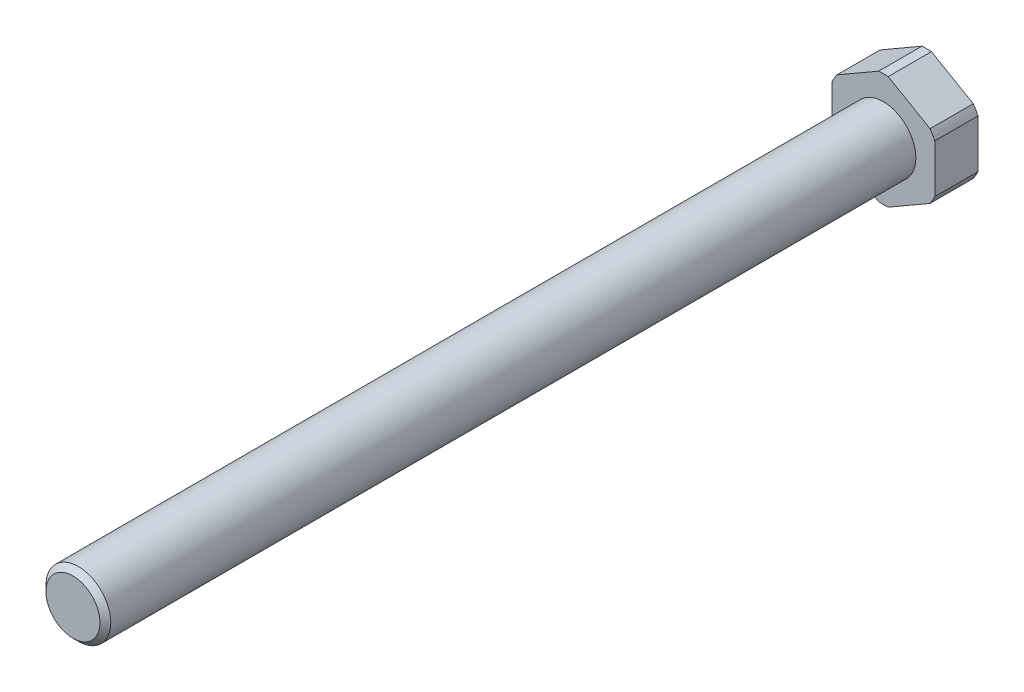
ISO-10303-21;
HEADER;
FILE_DESCRIPTION(('STEP AP214'),'2;1');
FILE_NAME('part.step','',(''),(''),'','','');
FILE_SCHEMA(('AUTOMOTIVE_DESIGN { 1 0 10303 214 1 1 1 1 }'));
ENDSEC;
DATA;
#1=APPLICATION_CONTEXT('core data for automotive mechanical design processes');
#2=APPLICATION_PROTOCOL_DEFINITION('international standard','automotive_design',2000,#1);
#3=PRODUCT_CONTEXT('',#1,'mechanical');
#4=PRODUCT('Part','Part','',(#3));
#5=PRODUCT_RELATED_PRODUCT_CATEGORY('part','',(#4));
#6=PRODUCT_DEFINITION_FORMATION('','',#4);
#7=PRODUCT_DEFINITION_CONTEXT('part definition',#1,'design');
#8=PRODUCT_DEFINITION('design','',#6,#7);
#9=PRODUCT_DEFINITION_SHAPE('','',#8);
#10=(LENGTH_UNIT() NAMED_UNIT(*) SI_UNIT(.MILLI.,.METRE.));
#11=(NAMED_UNIT(*) PLANE_ANGLE_UNIT() SI_UNIT($,.RADIAN.));
#12=(NAMED_UNIT(*) SI_UNIT($,.STERADIAN.) SOLID_ANGLE_UNIT());
#13=UNCERTAINTY_MEASURE_WITH_UNIT(LENGTH_MEASURE(1.E-05),#10,'distance_accuracy_value','');
#14=(GEOMETRIC_REPRESENTATION_CONTEXT(3) GLOBAL_UNCERTAINTY_ASSIGNED_CONTEXT((#13)) GLOBAL_UNIT_ASSIGNED_CONTEXT((#10,
#11,#12)) REPRESENTATION_CONTEXT('',''));
#15=CARTESIAN_POINT('',(0.,0.,0.));
#16=DIRECTION('',(0.,0.,1.));
#17=DIRECTION('',(1.,0.,0.));
#18=AXIS2_PLACEMENT_3D('',#15,#16,#17);
#19=CARTESIAN_POINT('',(0.,0.,8.));
#20=DIRECTION('',(0.,0.,-1.));
#21=DIRECTION('',(-1.,0.,0.));
#22=AXIS2_PLACEMENT_3D('',#19,#20,#21);
#23=CYLINDRICAL_SURFACE('',#22,10.5);
#24=CARTESIAN_POINT('',(0.,0.,8.));
#25=DIRECTION('',(0.,0.,1.));
#26=DIRECTION('',(1.,0.,0.));
#27=AXIS2_PLACEMENT_3D('',#24,#25,#26);
#28=CIRCLE('',#27,10.5);
#29=CARTESIAN_POINT('',(0.877016653792627,10.463309313452,8.));
#30=VERTEX_POINT('',#29);
#31=CARTESIAN_POINT('',(-0.877016653792554,10.463309313452,8.));
#32=VERTEX_POINT('',#31);
#33=EDGE_CURVE('E148',#30,#32,#28,.T.);
#34=ORIENTED_EDGE('',*,*,#33,.F.);
#35=DIRECTION('',(0.,0.,1.));
#36=VECTOR('',#35,1.);
#37=CARTESIAN_POINT('',(0.877016653792627,10.463309313452,0.));
#38=LINE('',#37,#36);
#39=CARTESIAN_POINT('',(0.877016653792627,10.463309313452,0.));
#40=VERTEX_POINT('',#39);
#41=EDGE_CURVE('E134',#40,#30,#38,.T.);
#42=ORIENTED_EDGE('',*,*,#41,.F.);
#43=CARTESIAN_POINT('',(0.,0.,0.));
#44=DIRECTION('',(0.,0.,1.));
#45=DIRECTION('',(1.,0.,0.));
#46=AXIS2_PLACEMENT_3D('',#43,#44,#45);
#47=CIRCLE('',#46,10.5);
#48=CARTESIAN_POINT('',(-0.877016653792554,10.463309313452,0.));
#49=VERTEX_POINT('',#48);
#50=EDGE_CURVE('E146',#40,#49,#47,.T.);
#51=ORIENTED_EDGE('',*,*,#50,.T.);
#52=DIRECTION('',(0.,0.,1.));
#53=VECTOR('',#52,1.);
#54=CARTESIAN_POINT('',(-0.877016653792554,10.463309313452,0.));
#55=LINE('',#54,#53);
#56=EDGE_CURVE('E243',#49,#32,#55,.T.);
#57=ORIENTED_EDGE('',*,*,#56,.T.);
#58=EDGE_LOOP('',(#34,#42,#51,#57));
#59=FACE_BOUND('',#58,.T.);
#60=ADVANCED_FACE('F44',(#59),#23,.T.);
#61=CARTESIAN_POINT('',(9.50000000000003,4.47213595499952,0.));
#62=VERTEX_POINT('',#61);
#63=CARTESIAN_POINT('',(8.62298334620744,5.99117335845234,0.));
#64=VERTEX_POINT('',#63);
#65=EDGE_CURVE('E156',#62,#64,#47,.T.);
#66=ORIENTED_EDGE('',*,*,#65,.T.);
#67=DIRECTION('',(0.,0.,1.));
#68=VECTOR('',#67,1.);
#69=CARTESIAN_POINT('',(8.62298334620745,5.99117335845233,0.));
#70=LINE('',#69,#68);
#71=CARTESIAN_POINT('',(8.62298334620745,5.99117335845233,8.));
#72=VERTEX_POINT('',#71);
#73=EDGE_CURVE('E60',#64,#72,#70,.T.);
#74=ORIENTED_EDGE('',*,*,#73,.T.);
#75=CARTESIAN_POINT('',(9.50000000000003,4.47213595499952,8.));
#76=VERTEX_POINT('',#75);
#77=EDGE_CURVE('E274',#76,#72,#28,.T.);
#78=ORIENTED_EDGE('',*,*,#77,.F.);
#79=DIRECTION('',(0.,0.,1.));
#80=VECTOR('',#79,1.);
#81=CARTESIAN_POINT('',(9.50000000000003,4.47213595499952,0.));
#82=LINE('',#81,#80);
#83=EDGE_CURVE('E200',#62,#76,#82,.T.);
#84=ORIENTED_EDGE('',*,*,#83,.F.);
#85=EDGE_LOOP('',(#66,#74,#78,#84));
#86=FACE_BOUND('',#85,.T.);
#87=ADVANCED_FACE('F312',(#86),#23,.T.);
#88=CARTESIAN_POINT('',(8.62298334620736,-5.99117335845245,0.));
#89=VERTEX_POINT('',#88);
#90=CARTESIAN_POINT('',(9.49999999999997,-4.47213595499965,0.));
#91=VERTEX_POINT('',#90);
#92=EDGE_CURVE('E163',#89,#91,#47,.T.);
#93=ORIENTED_EDGE('',*,*,#92,.T.);
#94=DIRECTION('',(0.,0.,1.));
#95=VECTOR('',#94,1.);
#96=CARTESIAN_POINT('',(9.49999999999997,-4.47213595499965,0.));
#97=LINE('',#96,#95);
#98=CARTESIAN_POINT('',(9.49999999999997,-4.47213595499965,8.));
#99=VERTEX_POINT('',#98);
#100=EDGE_CURVE('E68',#91,#99,#97,.T.);
#101=ORIENTED_EDGE('',*,*,#100,.T.);
#102=CARTESIAN_POINT('',(8.62298334620736,-5.99117335845245,8.));
#103=VERTEX_POINT('',#102);
#104=EDGE_CURVE('E272',#103,#99,#28,.T.);
#105=ORIENTED_EDGE('',*,*,#104,.F.);
#106=DIRECTION('',(0.,0.,1.));
#107=VECTOR('',#106,1.);
#108=CARTESIAN_POINT('',(8.62298334620736,-5.99117335845245,0.));
#109=LINE('',#108,#107);
#110=EDGE_CURVE('E194',#89,#103,#109,.T.);
#111=ORIENTED_EDGE('',*,*,#110,.F.);
#112=EDGE_LOOP('',(#93,#101,#105,#111));
#113=FACE_BOUND('',#112,.T.);
#114=ADVANCED_FACE('F191',(#113),#23,.T.);
#115=CARTESIAN_POINT('',(-0.877016653792701,-10.4633093134519,0.));
#116=VERTEX_POINT('',#115);
#117=CARTESIAN_POINT('',(0.877016653792476,-10.463309313452,0.));
#118=VERTEX_POINT('',#117);
#119=EDGE_CURVE('E165',#116,#118,#47,.T.);
#120=ORIENTED_EDGE('',*,*,#119,.T.);
#121=DIRECTION('',(0.,0.,1.));
#122=VECTOR('',#121,1.);
#123=CARTESIAN_POINT('',(0.877016653792481,-10.463309313452,0.));
#124=LINE('',#123,#122);
#125=CARTESIAN_POINT('',(0.877016653792481,-10.463309313452,8.));
#126=VERTEX_POINT('',#125);
#127=EDGE_CURVE('E207',#118,#126,#124,.T.);
#128=ORIENTED_EDGE('',*,*,#127,.T.);
#129=CARTESIAN_POINT('',(-0.877016653792701,-10.4633093134519,8.));
#130=VERTEX_POINT('',#129);
#131=EDGE_CURVE('E178',#130,#126,#28,.T.);
#132=ORIENTED_EDGE('',*,*,#131,.F.);
#133=DIRECTION('',(0.,0.,1.));
#134=VECTOR('',#133,1.);
#135=CARTESIAN_POINT('',(-0.877016653792701,-10.4633093134519,0.));
#136=LINE('',#135,#134);
#137=EDGE_CURVE('E227',#116,#130,#136,.T.);
#138=ORIENTED_EDGE('',*,*,#137,.F.);
#139=EDGE_LOOP('',(#120,#128,#132,#138));
#140=FACE_BOUND('',#139,.T.);
#141=ADVANCED_FACE('F289',(#140),#23,.T.);
#142=CARTESIAN_POINT('',(-8.62298334620741,5.99117335845239,8.));
#143=VERTEX_POINT('',#142);
#144=CARTESIAN_POINT('',(-9.5,4.47213595499958,8.));
#145=VERTEX_POINT('',#144);
#146=EDGE_CURVE('E169',#143,#145,#28,.T.);
#147=ORIENTED_EDGE('',*,*,#146,.F.);
#148=DIRECTION('',(0.,0.,1.));
#149=VECTOR('',#148,1.);
#150=CARTESIAN_POINT('',(-8.62298334620741,5.99117335845239,0.));
#151=LINE('',#150,#149);
#152=CARTESIAN_POINT('',(-8.62298334620741,5.99117335845239,0.));
#153=VERTEX_POINT('',#152);
#154=EDGE_CURVE('E238',#153,#143,#151,.T.);
#155=ORIENTED_EDGE('',*,*,#154,.F.);
#156=CARTESIAN_POINT('',(-9.5,4.47213595499958,0.));
#157=VERTEX_POINT('',#156);
#158=EDGE_CURVE('E157',#153,#157,#47,.T.);
#159=ORIENTED_EDGE('',*,*,#158,.T.);
#160=DIRECTION('',(0.,0.,1.));
#161=VECTOR('',#160,1.);
#162=CARTESIAN_POINT('',(-9.5,4.47213595499958,0.));
#163=LINE('',#162,#161);
#164=EDGE_CURVE('E164',#157,#145,#163,.T.);
#165=ORIENTED_EDGE('',*,*,#164,.T.);
#166=EDGE_LOOP('',(#147,#155,#159,#165));
#167=FACE_BOUND('',#166,.T.);
#168=ADVANCED_FACE('F299',(#167),#23,.T.);
#169=CARTESIAN_POINT('',(-9.5,-4.47213595499958,0.));
#170=VERTEX_POINT('',#169);
#171=CARTESIAN_POINT('',(-8.62298334620749,-5.99117335845227,0.));
#172=VERTEX_POINT('',#171);
#173=EDGE_CURVE('E159',#170,#172,#47,.T.);
#174=ORIENTED_EDGE('',*,*,#173,.T.);
#175=DIRECTION('',(0.,0.,1.));
#176=VECTOR('',#175,1.);
#177=CARTESIAN_POINT('',(-8.62298334620749,-5.99117335845227,0.));
#178=LINE('',#177,#176);
#179=CARTESIAN_POINT('',(-8.62298334620749,-5.99117335845227,8.));
#180=VERTEX_POINT('',#179);
#181=EDGE_CURVE('E218',#172,#180,#178,.T.);
#182=ORIENTED_EDGE('',*,*,#181,.T.);
#183=CARTESIAN_POINT('',(-9.5,-4.47213595499958,8.));
#184=VERTEX_POINT('',#183);
#185=EDGE_CURVE('E177',#184,#180,#28,.T.);
#186=ORIENTED_EDGE('',*,*,#185,.F.);
#187=DIRECTION('',(0.,0.,1.));
#188=VECTOR('',#187,1.);
#189=CARTESIAN_POINT('',(-9.5,-4.47213595499958,0.));
#190=LINE('',#189,#188);
#191=EDGE_CURVE('E253',#170,#184,#190,.T.);
#192=ORIENTED_EDGE('',*,*,#191,.F.);
#193=EDGE_LOOP('',(#174,#182,#186,#192));
#194=FACE_BOUND('',#193,.T.);
#195=ADVANCED_FACE('F292',(#194),#23,.T.);
#196=CARTESIAN_POINT('',(0.,0.,8.));
#197=DIRECTION('',(0.,0.,1.));
#198=DIRECTION('',(1.,0.,0.));
#199=AXIS2_PLACEMENT_3D('',#196,#197,#198);
#200=PLANE('',#199);
#201=CARTESIAN_POINT('',(0.,0.,8.));
#202=DIRECTION('',(0.,0.,1.));
#203=DIRECTION('',(1.,0.,0.));
#204=AXIS2_PLACEMENT_3D('',#201,#202,#203);
#205=CIRCLE('',#204,6.);
#206=CARTESIAN_POINT('',(6.,0.,8.));
#207=VERTEX_POINT('',#206);
#208=EDGE_CURVE('E231',#207,#207,#205,.T.);
#209=ORIENTED_EDGE('',*,*,#208,.F.);
#210=EDGE_LOOP('',(#209));
#211=FACE_BOUND('',#210,.T.);
#212=DIRECTION('',(0.866025403784436,-0.500000000000004,0.));
#213=VECTOR('',#212,1.);
#214=CARTESIAN_POINT('',(8.62298334620745,5.99117335845233,8.));
#215=LINE('',#214,#213);
#216=EDGE_CURVE('E141',#30,#72,#215,.T.);
#217=ORIENTED_EDGE('',*,*,#216,.F.);
#218=ORIENTED_EDGE('',*,*,#33,.T.);
#219=DIRECTION('',(0.86602540378444,0.499999999999998,0.));
#220=VECTOR('',#219,1.);
#221=CARTESIAN_POINT('',(-0.877016653792554,10.463309313452,8.));
#222=LINE('',#221,#220);
#223=EDGE_CURVE('E239',#143,#32,#222,.T.);
#224=ORIENTED_EDGE('',*,*,#223,.F.);
#225=ORIENTED_EDGE('',*,*,#146,.T.);
#226=DIRECTION('',(0.,1.,0.));
#227=VECTOR('',#226,1.);
#228=CARTESIAN_POINT('',(-9.5,4.47213595499958,8.));
#229=LINE('',#228,#227);
#230=EDGE_CURVE('E246',#184,#145,#229,.T.);
#231=ORIENTED_EDGE('',*,*,#230,.F.);
#232=ORIENTED_EDGE('',*,*,#185,.T.);
#233=DIRECTION('',(-0.866025403784433,0.50000000000001,0.));
#234=VECTOR('',#233,1.);
#235=CARTESIAN_POINT('',(-8.62298334620749,-5.99117335845227,8.));
#236=LINE('',#235,#234);
#237=EDGE_CURVE('E228',#130,#180,#236,.T.);
#238=ORIENTED_EDGE('',*,*,#237,.F.);
#239=ORIENTED_EDGE('',*,*,#131,.T.);
#240=DIRECTION('',(-0.866025403784443,-0.499999999999992,0.));
#241=VECTOR('',#240,1.);
#242=CARTESIAN_POINT('',(0.877016653792481,-10.463309313452,8.));
#243=LINE('',#242,#241);
#244=EDGE_CURVE('E215',#103,#126,#243,.T.);
#245=ORIENTED_EDGE('',*,*,#244,.F.);
#246=ORIENTED_EDGE('',*,*,#104,.T.);
#247=DIRECTION('',(0.,-1.,0.));
#248=VECTOR('',#247,1.);
#249=CARTESIAN_POINT('',(9.49999999999997,-4.47213595499965,8.));
#250=LINE('',#249,#248);
#251=EDGE_CURVE('E201',#76,#99,#250,.T.);
#252=ORIENTED_EDGE('',*,*,#251,.F.);
#253=ORIENTED_EDGE('',*,*,#77,.T.);
#254=EDGE_LOOP('',(#217,#218,#224,#225,#231,#232,#238,#239,#245,#246,#252,#253));
#255=FACE_BOUND('',#254,.T.);
#256=ADVANCED_FACE('F285',(#211,#255),#200,.T.);
#257=CARTESIAN_POINT('',(0.,0.,0.));
#258=DIRECTION('',(0.,0.,1.));
#259=DIRECTION('',(1.,0.,0.));
#260=AXIS2_PLACEMENT_3D('',#257,#258,#259);
#261=PLANE('',#260);
#262=ORIENTED_EDGE('',*,*,#50,.F.);
#263=DIRECTION('',(0.866025403784436,-0.500000000000004,0.));
#264=VECTOR('',#263,1.);
#265=CARTESIAN_POINT('',(8.62298334620745,5.99117335845233,0.));
#266=LINE('',#265,#264);
#267=EDGE_CURVE('E131',#40,#64,#266,.T.);
#268=ORIENTED_EDGE('',*,*,#267,.T.);
#269=ORIENTED_EDGE('',*,*,#65,.F.);
#270=DIRECTION('',(0.,-1.,0.));
#271=VECTOR('',#270,1.);
#272=CARTESIAN_POINT('',(9.49999999999997,-4.47213595499965,0.));
#273=LINE('',#272,#271);
#274=EDGE_CURVE('E197',#62,#91,#273,.T.);
#275=ORIENTED_EDGE('',*,*,#274,.T.);
#276=ORIENTED_EDGE('',*,*,#92,.F.);
#277=DIRECTION('',(-0.866025403784443,-0.499999999999992,0.));
#278=VECTOR('',#277,1.);
#279=CARTESIAN_POINT('',(0.877016653792481,-10.463309313452,0.));
#280=LINE('',#279,#278);
#281=EDGE_CURVE('E196',#89,#118,#280,.T.);
#282=ORIENTED_EDGE('',*,*,#281,.T.);
#283=ORIENTED_EDGE('',*,*,#119,.F.);
#284=DIRECTION('',(-0.866025403784433,0.50000000000001,0.));
#285=VECTOR('',#284,1.);
#286=CARTESIAN_POINT('',(-8.62298334620749,-5.99117335845227,0.));
#287=LINE('',#286,#285);
#288=EDGE_CURVE('E223',#116,#172,#287,.T.);
#289=ORIENTED_EDGE('',*,*,#288,.T.);
#290=ORIENTED_EDGE('',*,*,#173,.F.);
#291=DIRECTION('',(0.,1.,0.));
#292=VECTOR('',#291,1.);
#293=CARTESIAN_POINT('',(-9.5,4.47213595499958,0.));
#294=LINE('',#293,#292);
#295=EDGE_CURVE('E249',#170,#157,#294,.T.);
#296=ORIENTED_EDGE('',*,*,#295,.T.);
#297=ORIENTED_EDGE('',*,*,#158,.F.);
#298=DIRECTION('',(0.86602540378444,0.499999999999998,0.));
#299=VECTOR('',#298,1.);
#300=CARTESIAN_POINT('',(-0.877016653792554,10.463309313452,0.));
#301=LINE('',#300,#299);
#302=EDGE_CURVE('E154',#153,#49,#301,.T.);
#303=ORIENTED_EDGE('',*,*,#302,.T.);
#304=EDGE_LOOP('',(#262,#268,#269,#275,#276,#282,#283,#289,#290,#296,#297,#303));
#305=FACE_BOUND('',#304,.T.);
#306=ADVANCED_FACE('F152',(#305),#261,.F.);
#307=CARTESIAN_POINT('',(-9.5,4.47213595499958,0.));
#308=DIRECTION('',(1.,0.,0.));
#309=DIRECTION('',(0.,0.,-1.));
#310=AXIS2_PLACEMENT_3D('',#307,#308,#309);
#311=PLANE('',#310);
#312=ORIENTED_EDGE('',*,*,#230,.T.);
#313=ORIENTED_EDGE('',*,*,#164,.F.);
#314=ORIENTED_EDGE('',*,*,#295,.F.);
#315=ORIENTED_EDGE('',*,*,#191,.T.);
#316=EDGE_LOOP('',(#312,#313,#314,#315));
#317=FACE_BOUND('',#316,.T.);
#318=ADVANCED_FACE('F294',(#317),#311,.F.);
#319=CARTESIAN_POINT('',(-0.877016653792554,10.463309313452,0.));
#320=DIRECTION('',(0.499999999999998,-0.86602540378444,0.));
#321=DIRECTION('',(0.86602540378444,0.499999999999998,0.));
#322=AXIS2_PLACEMENT_3D('',#319,#320,#321);
#323=PLANE('',#322);
#324=ORIENTED_EDGE('',*,*,#223,.T.);
#325=ORIENTED_EDGE('',*,*,#56,.F.);
#326=ORIENTED_EDGE('',*,*,#302,.F.);
#327=ORIENTED_EDGE('',*,*,#154,.T.);
#328=EDGE_LOOP('',(#324,#325,#326,#327));
#329=FACE_BOUND('',#328,.T.);
#330=ADVANCED_FACE('F301',(#329),#323,.F.);
#331=CARTESIAN_POINT('',(-8.62298334620749,-5.99117335845227,0.));
#332=DIRECTION('',(0.50000000000001,0.866025403784433,0.));
#333=DIRECTION('',(-0.866025403784433,0.50000000000001,0.));
#334=AXIS2_PLACEMENT_3D('',#331,#332,#333);
#335=PLANE('',#334);
#336=ORIENTED_EDGE('',*,*,#237,.T.);
#337=ORIENTED_EDGE('',*,*,#181,.F.);
#338=ORIENTED_EDGE('',*,*,#288,.F.);
#339=ORIENTED_EDGE('',*,*,#137,.T.);
#340=EDGE_LOOP('',(#336,#337,#338,#339));
#341=FACE_BOUND('',#340,.T.);
#342=ADVANCED_FACE('F291',(#341),#335,.F.);
#343=CARTESIAN_POINT('',(0.877016653792481,-10.463309313452,0.));
#344=DIRECTION('',(-0.499999999999992,0.866025403784443,0.));
#345=DIRECTION('',(-0.866025403784443,-0.499999999999992,0.));
#346=AXIS2_PLACEMENT_3D('',#343,#344,#345);
#347=PLANE('',#346);
#348=ORIENTED_EDGE('',*,*,#244,.T.);
#349=ORIENTED_EDGE('',*,*,#127,.F.);
#350=ORIENTED_EDGE('',*,*,#281,.F.);
#351=ORIENTED_EDGE('',*,*,#110,.T.);
#352=EDGE_LOOP('',(#348,#349,#350,#351));
#353=FACE_BOUND('',#352,.T.);
#354=ADVANCED_FACE('F288',(#353),#347,.F.);
#355=CARTESIAN_POINT('',(9.49999999999997,-4.47213595499965,0.));
#356=DIRECTION('',(-1.,0.,0.));
#357=DIRECTION('',(0.,-1.,0.));
#358=AXIS2_PLACEMENT_3D('',#355,#356,#357);
#359=PLANE('',#358);
#360=ORIENTED_EDGE('',*,*,#251,.T.);
#361=ORIENTED_EDGE('',*,*,#100,.F.);
#362=ORIENTED_EDGE('',*,*,#274,.F.);
#363=ORIENTED_EDGE('',*,*,#83,.T.);
#364=EDGE_LOOP('',(#360,#361,#362,#363));
#365=FACE_BOUND('',#364,.T.);
#366=ADVANCED_FACE('F362',(#365),#359,.F.);
#367=CARTESIAN_POINT('',(8.62298334620745,5.99117335845233,0.));
#368=DIRECTION('',(-0.500000000000004,-0.866025403784436,0.));
#369=DIRECTION('',(0.866025403784436,-0.500000000000004,0.));
#370=AXIS2_PLACEMENT_3D('',#367,#368,#369);
#371=PLANE('',#370);
#372=ORIENTED_EDGE('',*,*,#216,.T.);
#373=ORIENTED_EDGE('',*,*,#73,.F.);
#374=ORIENTED_EDGE('',*,*,#267,.F.);
#375=ORIENTED_EDGE('',*,*,#41,.T.);
#376=EDGE_LOOP('',(#372,#373,#374,#375));
#377=FACE_BOUND('',#376,.T.);
#378=ADVANCED_FACE('F133',(#377),#371,.F.);
#379=CARTESIAN_POINT('',(0.,0.,158.));
#380=DIRECTION('',(0.,0.,-1.));
#381=DIRECTION('',(-1.,0.,0.));
#382=AXIS2_PLACEMENT_3D('',#379,#380,#381);
#383=CYLINDRICAL_SURFACE('',#382,6.);
#384=CARTESIAN_POINT('',(0.,0.,157.));
#385=DIRECTION('',(0.,0.,1.));
#386=DIRECTION('',(1.,0.,0.));
#387=AXIS2_PLACEMENT_3D('',#384,#385,#386);
#388=CIRCLE('',#387,6.);
#389=CARTESIAN_POINT('',(6.,0.,157.));
#390=VERTEX_POINT('',#389);
#391=EDGE_CURVE('E11',#390,#390,#388,.F.);
#392=ORIENTED_EDGE('',*,*,#391,.T.);
#393=EDGE_LOOP('',(#392));
#394=FACE_BOUND('',#393,.T.);
#395=ORIENTED_EDGE('',*,*,#208,.T.);
#396=EDGE_LOOP('',(#395));
#397=FACE_BOUND('',#396,.T.);
#398=ADVANCED_FACE('F377',(#394,#397),#383,.T.);
#399=CARTESIAN_POINT('',(0.,0.,158.));
#400=DIRECTION('',(0.,0.,1.));
#401=DIRECTION('',(1.,0.,0.));
#402=AXIS2_PLACEMENT_3D('',#399,#400,#401);
#403=PLANE('',#402);
#404=CARTESIAN_POINT('',(0.,0.,158.));
#405=DIRECTION('',(0.,0.,1.));
#406=DIRECTION('',(1.,0.,0.));
#407=AXIS2_PLACEMENT_3D('',#404,#405,#406);
#408=CIRCLE('',#407,5.);
#409=CARTESIAN_POINT('',(5.,0.,158.));
#410=VERTEX_POINT('',#409);
#411=EDGE_CURVE('E53',#410,#410,#408,.T.);
#412=ORIENTED_EDGE('',*,*,#411,.T.);
#413=EDGE_LOOP('',(#412));
#414=FACE_BOUND('',#413,.T.);
#415=ADVANCED_FACE('F385',(#414),#403,.T.);
#416=CARTESIAN_POINT('',(0.,0.,158.));
#417=DIRECTION('',(0.,0.,-1.));
#418=DIRECTION('',(-1.,0.,0.));
#419=AXIS2_PLACEMENT_3D('',#416,#417,#418);
#420=CONICAL_SURFACE('',#419,5.,0.785398163397435);
#421=ORIENTED_EDGE('',*,*,#391,.F.);
#422=EDGE_LOOP('',(#421));
#423=FACE_BOUND('',#422,.T.);
#424=ORIENTED_EDGE('',*,*,#411,.F.);
#425=EDGE_LOOP('',(#424));
#426=FACE_BOUND('',#425,.T.);
#427=ADVANCED_FACE('F46',(#423,#426),#420,.T.);
#428=CLOSED_SHELL('',(#60,#87,#114,#141,#168,#195,#256,#306,#318,#330,#342,#354,#366,#378,#398,
#415,#427));
#429=MANIFOLD_SOLID_BREP('B2',#428);
#430=ADVANCED_BREP_SHAPE_REPRESENTATION('',(#18,#429),#14);
#431=SHAPE_DEFINITION_REPRESENTATION(#9,#430);
ENDSEC;
END-ISO-10303-21;
